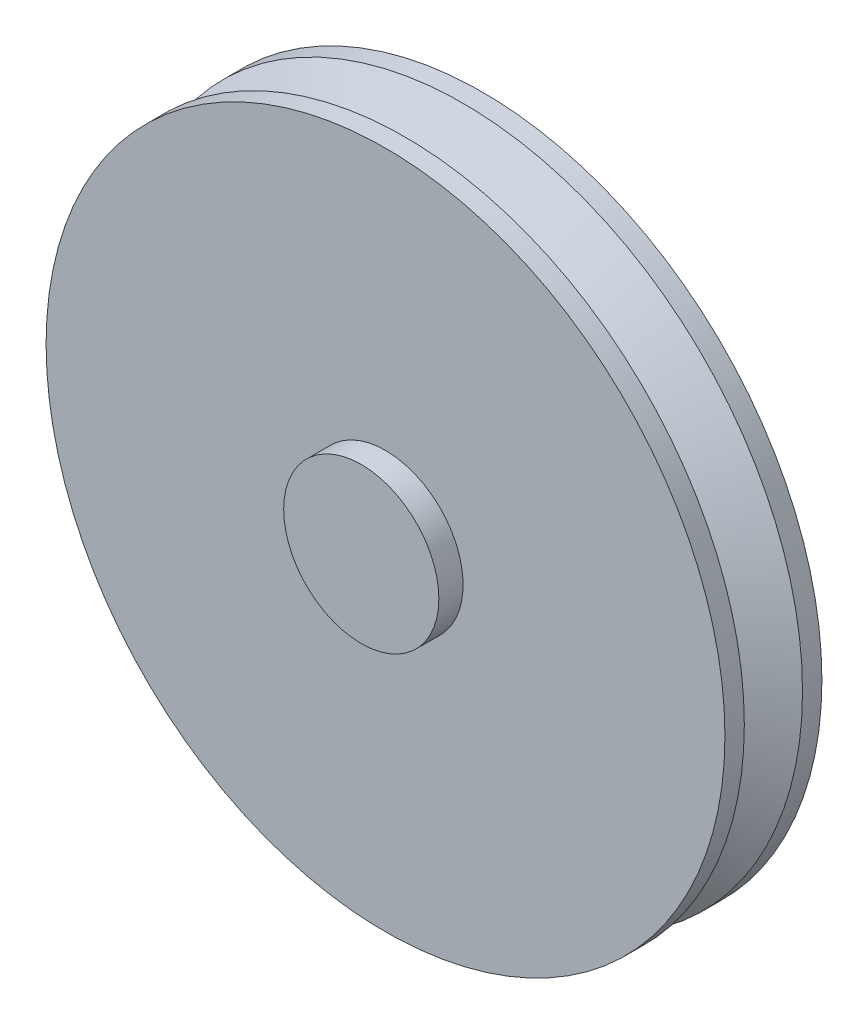
ISO-10303-21;
HEADER;
FILE_DESCRIPTION(('STEP AP214'),'2;1');
FILE_NAME('part.step','',(''),(''),'','','');
FILE_SCHEMA(('AUTOMOTIVE_DESIGN { 1 0 10303 214 1 1 1 1 }'));
ENDSEC;
DATA;
#1=APPLICATION_CONTEXT('core data for automotive mechanical design processes');
#2=APPLICATION_PROTOCOL_DEFINITION('international standard','automotive_design',2000,#1);
#3=PRODUCT_CONTEXT('',#1,'mechanical');
#4=PRODUCT('Part','Part','',(#3));
#5=PRODUCT_RELATED_PRODUCT_CATEGORY('part','',(#4));
#6=PRODUCT_DEFINITION_FORMATION('','',#4);
#7=PRODUCT_DEFINITION_CONTEXT('part definition',#1,'design');
#8=PRODUCT_DEFINITION('design','',#6,#7);
#9=PRODUCT_DEFINITION_SHAPE('','',#8);
#10=(LENGTH_UNIT() NAMED_UNIT(*) SI_UNIT(.MILLI.,.METRE.));
#11=(NAMED_UNIT(*) PLANE_ANGLE_UNIT() SI_UNIT($,.RADIAN.));
#12=(NAMED_UNIT(*) SI_UNIT($,.STERADIAN.) SOLID_ANGLE_UNIT());
#13=UNCERTAINTY_MEASURE_WITH_UNIT(LENGTH_MEASURE(1.E-05),#10,'distance_accuracy_value','');
#14=(GEOMETRIC_REPRESENTATION_CONTEXT(3) GLOBAL_UNCERTAINTY_ASSIGNED_CONTEXT((#13)) GLOBAL_UNIT_ASSIGNED_CONTEXT((#10,
#11,#12)) REPRESENTATION_CONTEXT('',''));
#15=CARTESIAN_POINT('',(0.,0.,0.));
#16=DIRECTION('',(0.,0.,1.));
#17=DIRECTION('',(1.,0.,0.));
#18=AXIS2_PLACEMENT_3D('',#15,#16,#17);
#19=CARTESIAN_POINT('',(0.,0.,2.54));
#20=DIRECTION('',(0.,0.,-1.));
#21=DIRECTION('',(-1.,0.,0.));
#22=AXIS2_PLACEMENT_3D('',#19,#20,#21);
#23=CYLINDRICAL_SURFACE('',#22,44.45);
#24=CARTESIAN_POINT('',(0.,0.,2.54));
#25=DIRECTION('',(0.,0.,-1.));
#26=DIRECTION('',(-1.,0.,0.));
#27=AXIS2_PLACEMENT_3D('',#24,#25,#26);
#28=CIRCLE('',#27,44.45);
#29=CARTESIAN_POINT('',(-44.45,0.,2.54));
#30=VERTEX_POINT('',#29);
#31=EDGE_CURVE('E41',#30,#30,#28,.F.);
#32=ORIENTED_EDGE('',*,*,#31,.F.);
#33=EDGE_LOOP('',(#32));
#34=FACE_BOUND('',#33,.T.);
#35=CARTESIAN_POINT('',(0.,0.,0.));
#36=DIRECTION('',(0.,0.,1.));
#37=DIRECTION('',(1.,0.,0.));
#38=AXIS2_PLACEMENT_3D('',#35,#36,#37);
#39=CIRCLE('',#38,44.45);
#40=CARTESIAN_POINT('',(44.45,0.,0.));
#41=VERTEX_POINT('',#40);
#42=EDGE_CURVE('E45',#41,#41,#39,.T.);
#43=ORIENTED_EDGE('',*,*,#42,.T.);
#44=EDGE_LOOP('',(#43));
#45=FACE_BOUND('',#44,.T.);
#46=ADVANCED_FACE('F35',(#34,#45),#23,.T.);
#47=CARTESIAN_POINT('',(0.,0.,0.));
#48=DIRECTION('',(0.,0.,1.));
#49=DIRECTION('',(1.,0.,0.));
#50=AXIS2_PLACEMENT_3D('',#47,#48,#49);
#51=PLANE('',#50);
#52=ORIENTED_EDGE('',*,*,#42,.F.);
#53=EDGE_LOOP('',(#52));
#54=FACE_BOUND('',#53,.T.);
#55=ADVANCED_FACE('F75',(#54),#51,.F.);
#56=CARTESIAN_POINT('',(0.,0.,6.35));
#57=DIRECTION('',(0.,0.,-1.));
#58=DIRECTION('',(-1.,0.,0.));
#59=AXIS2_PLACEMENT_3D('',#56,#57,#58);
#60=CONICAL_SURFACE('',#59,38.1,1.03037682652431);
#61=ORIENTED_EDGE('',*,*,#31,.T.);
#62=EDGE_LOOP('',(#61));
#63=FACE_BOUND('',#62,.T.);
#64=CARTESIAN_POINT('',(0.,0.,6.35));
#65=DIRECTION('',(0.,0.,1.));
#66=DIRECTION('',(1.,0.,0.));
#67=AXIS2_PLACEMENT_3D('',#64,#65,#66);
#68=CIRCLE('',#67,38.1);
#69=CARTESIAN_POINT('',(38.1,0.,6.35));
#70=VERTEX_POINT('',#69);
#71=EDGE_CURVE('E50',#70,#70,#68,.T.);
#72=ORIENTED_EDGE('',*,*,#71,.F.);
#73=EDGE_LOOP('',(#72));
#74=FACE_BOUND('',#73,.T.);
#75=ADVANCED_FACE('F65',(#63,#74),#60,.T.);
#76=CARTESIAN_POINT('',(0.,0.,10.16));
#77=DIRECTION('',(0.,0.,1.));
#78=DIRECTION('',(-1.,0.,0.));
#79=AXIS2_PLACEMENT_3D('',#76,#77,#78);
#80=CYLINDRICAL_SURFACE('',#79,44.45);
#81=CARTESIAN_POINT('',(0.,0.,10.16));
#82=DIRECTION('',(0.,0.,-1.));
#83=DIRECTION('',(-1.,0.,0.));
#84=AXIS2_PLACEMENT_3D('',#81,#82,#83);
#85=CIRCLE('',#84,44.45);
#86=CARTESIAN_POINT('',(-44.45,0.,10.16));
#87=VERTEX_POINT('',#86);
#88=EDGE_CURVE('E58',#87,#87,#85,.F.);
#89=ORIENTED_EDGE('',*,*,#88,.T.);
#90=EDGE_LOOP('',(#89));
#91=FACE_BOUND('',#90,.T.);
#92=CARTESIAN_POINT('',(0.,0.,12.7));
#93=DIRECTION('',(0.,0.,1.));
#94=DIRECTION('',(1.,0.,0.));
#95=AXIS2_PLACEMENT_3D('',#92,#93,#94);
#96=CIRCLE('',#95,44.45);
#97=CARTESIAN_POINT('',(44.45,0.,12.7));
#98=VERTEX_POINT('',#97);
#99=EDGE_CURVE('E155',#98,#98,#96,.T.);
#100=ORIENTED_EDGE('',*,*,#99,.F.);
#101=EDGE_LOOP('',(#100));
#102=FACE_BOUND('',#101,.T.);
#103=ADVANCED_FACE('F74',(#91,#102),#80,.T.);
#104=CARTESIAN_POINT('',(0.,0.,12.7));
#105=DIRECTION('',(0.,0.,-1.));
#106=DIRECTION('',(1.,0.,0.));
#107=AXIS2_PLACEMENT_3D('',#104,#105,#106);
#108=PLANE('',#107);
#109=CARTESIAN_POINT('',(0.,0.,12.7));
#110=DIRECTION('',(0.,0.,-1.));
#111=DIRECTION('',(-1.,0.,0.));
#112=AXIS2_PLACEMENT_3D('',#109,#110,#111);
#113=CIRCLE('',#112,10.16);
#114=CARTESIAN_POINT('',(-10.16,0.,12.7));
#115=VERTEX_POINT('',#114);
#116=EDGE_CURVE('E11',#115,#115,#113,.F.);
#117=ORIENTED_EDGE('',*,*,#116,.F.);
#118=EDGE_LOOP('',(#117));
#119=FACE_BOUND('',#118,.T.);
#120=ORIENTED_EDGE('',*,*,#99,.T.);
#121=EDGE_LOOP('',(#120));
#122=FACE_BOUND('',#121,.T.);
#123=ADVANCED_FACE('F102',(#119,#122),#108,.F.);
#124=CARTESIAN_POINT('',(0.,0.,6.35));
#125=DIRECTION('',(0.,0.,1.));
#126=DIRECTION('',(-1.,0.,0.));
#127=AXIS2_PLACEMENT_3D('',#124,#125,#126);
#128=CONICAL_SURFACE('',#127,38.1,1.03037682652431);
#129=ORIENTED_EDGE('',*,*,#88,.F.);
#130=EDGE_LOOP('',(#129));
#131=FACE_BOUND('',#130,.T.);
#132=ORIENTED_EDGE('',*,*,#71,.T.);
#133=EDGE_LOOP('',(#132));
#134=FACE_BOUND('',#133,.T.);
#135=ADVANCED_FACE('F111',(#131,#134),#128,.T.);
#136=CARTESIAN_POINT('',(0.,0.,15.875));
#137=DIRECTION('',(0.,0.,-1.));
#138=DIRECTION('',(-1.,0.,0.));
#139=AXIS2_PLACEMENT_3D('',#136,#137,#138);
#140=CYLINDRICAL_SURFACE('',#139,10.16);
#141=CARTESIAN_POINT('',(0.,0.,15.875));
#142=DIRECTION('',(0.,0.,1.));
#143=DIRECTION('',(1.,0.,0.));
#144=AXIS2_PLACEMENT_3D('',#141,#142,#143);
#145=CIRCLE('',#144,10.16);
#146=CARTESIAN_POINT('',(10.16,0.,15.875));
#147=VERTEX_POINT('',#146);
#148=EDGE_CURVE('E163',#147,#147,#145,.T.);
#149=ORIENTED_EDGE('',*,*,#148,.F.);
#150=EDGE_LOOP('',(#149));
#151=FACE_BOUND('',#150,.T.);
#152=ORIENTED_EDGE('',*,*,#116,.T.);
#153=EDGE_LOOP('',(#152));
#154=FACE_BOUND('',#153,.T.);
#155=ADVANCED_FACE('F119',(#151,#154),#140,.T.);
#156=CARTESIAN_POINT('',(0.,0.,15.875));
#157=DIRECTION('',(0.,0.,1.));
#158=DIRECTION('',(1.,0.,0.));
#159=AXIS2_PLACEMENT_3D('',#156,#157,#158);
#160=PLANE('',#159);
#161=ORIENTED_EDGE('',*,*,#148,.T.);
#162=EDGE_LOOP('',(#161));
#163=FACE_BOUND('',#162,.T.);
#164=ADVANCED_FACE('F127',(#163),#160,.T.);
#165=CLOSED_SHELL('',(#46,#55,#75,#103,#123,#135,#155,#164));
#166=MANIFOLD_SOLID_BREP('B2',#165);
#167=ADVANCED_BREP_SHAPE_REPRESENTATION('',(#18,#166),#14);
#168=SHAPE_DEFINITION_REPRESENTATION(#9,#167);
ENDSEC;
END-ISO-10303-21;
